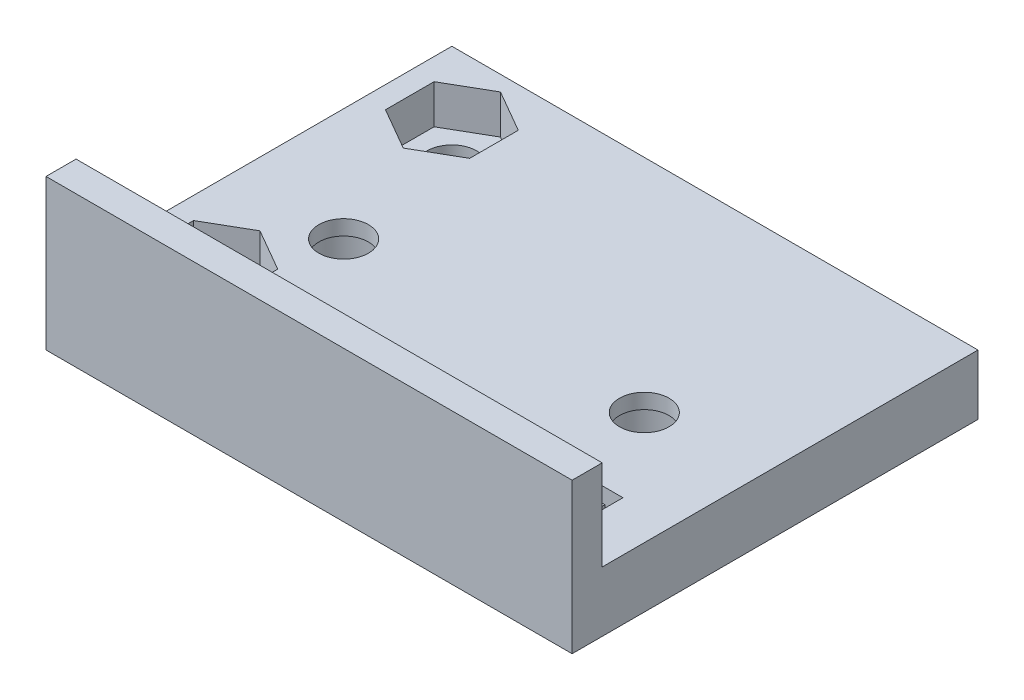
ISO-10303-21;
HEADER;
FILE_DESCRIPTION(('STEP AP214'),'2;1');
FILE_NAME('part.step','',(''),(''),'','','');
FILE_SCHEMA(('AUTOMOTIVE_DESIGN { 1 0 10303 214 1 1 1 1 }'));
ENDSEC;
DATA;
#1=APPLICATION_CONTEXT('core data for automotive mechanical design processes');
#2=APPLICATION_PROTOCOL_DEFINITION('international standard','automotive_design',2000,#1);
#3=PRODUCT_CONTEXT('',#1,'mechanical');
#4=PRODUCT('Part','Part','',(#3));
#5=PRODUCT_RELATED_PRODUCT_CATEGORY('part','',(#4));
#6=PRODUCT_DEFINITION_FORMATION('','',#4);
#7=PRODUCT_DEFINITION_CONTEXT('part definition',#1,'design');
#8=PRODUCT_DEFINITION('design','',#6,#7);
#9=PRODUCT_DEFINITION_SHAPE('','',#8);
#10=(LENGTH_UNIT() NAMED_UNIT(*) SI_UNIT(.MILLI.,.METRE.));
#11=(NAMED_UNIT(*) PLANE_ANGLE_UNIT() SI_UNIT($,.RADIAN.));
#12=(NAMED_UNIT(*) SI_UNIT($,.STERADIAN.) SOLID_ANGLE_UNIT());
#13=UNCERTAINTY_MEASURE_WITH_UNIT(LENGTH_MEASURE(1.E-05),#10,'distance_accuracy_value','');
#14=(GEOMETRIC_REPRESENTATION_CONTEXT(3) GLOBAL_UNCERTAINTY_ASSIGNED_CONTEXT((#13)) GLOBAL_UNIT_ASSIGNED_CONTEXT((#10,
#11,#12)) REPRESENTATION_CONTEXT('',''));
#15=CARTESIAN_POINT('',(0.,0.,0.));
#16=DIRECTION('',(0.,0.,1.));
#17=DIRECTION('',(1.,0.,0.));
#18=AXIS2_PLACEMENT_3D('',#15,#16,#17);
#19=CARTESIAN_POINT('',(10.,4.,1.2));
#20=DIRECTION('',(0.,-1.,0.));
#21=DIRECTION('',(0.,0.,-1.));
#22=AXIS2_PLACEMENT_3D('',#19,#20,#21);
#23=CYLINDRICAL_SURFACE('',#22,1.65);
#24=CARTESIAN_POINT('',(10.,4.,1.2));
#25=DIRECTION('',(0.,1.,0.));
#26=DIRECTION('',(0.,0.,1.));
#27=AXIS2_PLACEMENT_3D('',#24,#25,#26);
#28=CIRCLE('',#27,1.65);
#29=CARTESIAN_POINT('',(10.,4.,2.85));
#30=VERTEX_POINT('',#29);
#31=EDGE_CURVE('E402',#30,#30,#28,.T.);
#32=ORIENTED_EDGE('',*,*,#31,.T.);
#33=EDGE_LOOP('',(#32));
#34=FACE_BOUND('',#33,.T.);
#35=CARTESIAN_POINT('',(10.,3.,1.2));
#36=DIRECTION('',(0.,-1.,0.));
#37=DIRECTION('',(0.,0.,-1.));
#38=AXIS2_PLACEMENT_3D('',#35,#36,#37);
#39=CIRCLE('',#38,1.65);
#40=CARTESIAN_POINT('',(10.,3.,-0.449999999999999));
#41=VERTEX_POINT('',#40);
#42=EDGE_CURVE('E49',#41,#41,#39,.T.);
#43=ORIENTED_EDGE('',*,*,#42,.T.);
#44=EDGE_LOOP('',(#43));
#45=FACE_BOUND('',#44,.T.);
#46=ADVANCED_FACE('F45',(#34,#45),#23,.F.);
#47=CARTESIAN_POINT('',(-9.99999999999999,4.,1.2));
#48=DIRECTION('',(0.,-1.,0.));
#49=DIRECTION('',(0.,0.,-1.));
#50=AXIS2_PLACEMENT_3D('',#47,#48,#49);
#51=CYLINDRICAL_SURFACE('',#50,1.65);
#52=CARTESIAN_POINT('',(-9.99999999999999,4.,1.2));
#53=DIRECTION('',(0.,1.,0.));
#54=DIRECTION('',(0.,0.,-1.));
#55=AXIS2_PLACEMENT_3D('',#52,#53,#54);
#56=CIRCLE('',#55,1.65);
#57=CARTESIAN_POINT('',(-9.99999999999999,4.,-0.449999999999997));
#58=VERTEX_POINT('',#57);
#59=EDGE_CURVE('E399',#58,#58,#56,.T.);
#60=ORIENTED_EDGE('',*,*,#59,.T.);
#61=EDGE_LOOP('',(#60));
#62=FACE_BOUND('',#61,.T.);
#63=CARTESIAN_POINT('',(-9.99999999999999,3.,1.2));
#64=DIRECTION('',(0.,-1.,0.));
#65=DIRECTION('',(0.,0.,-1.));
#66=AXIS2_PLACEMENT_3D('',#63,#64,#65);
#67=CIRCLE('',#66,1.65);
#68=CARTESIAN_POINT('',(-9.99999999999999,3.,-0.449999999999997));
#69=VERTEX_POINT('',#68);
#70=EDGE_CURVE('E265',#69,#69,#67,.T.);
#71=ORIENTED_EDGE('',*,*,#70,.T.);
#72=EDGE_LOOP('',(#71));
#73=FACE_BOUND('',#72,.T.);
#74=ADVANCED_FACE('F499',(#62,#73),#51,.F.);
#75=CARTESIAN_POINT('',(-13.25,8.66690475583122,6.75));
#76=DIRECTION('',(0.,-1.,0.));
#77=DIRECTION('',(0.,0.,-1.));
#78=AXIS2_PLACEMENT_3D('',#75,#76,#77);
#79=CYLINDRICAL_SURFACE('',#78,1.65);
#80=CARTESIAN_POINT('',(-13.25,0.,6.75));
#81=DIRECTION('',(0.,-1.,0.));
#82=DIRECTION('',(0.,0.,1.));
#83=AXIS2_PLACEMENT_3D('',#80,#81,#82);
#84=CIRCLE('',#83,1.65);
#85=CARTESIAN_POINT('',(-13.25,0.,8.4));
#86=VERTEX_POINT('',#85);
#87=EDGE_CURVE('E377',#86,#86,#84,.T.);
#88=ORIENTED_EDGE('',*,*,#87,.T.);
#89=EDGE_LOOP('',(#88));
#90=FACE_BOUND('',#89,.T.);
#91=CARTESIAN_POINT('',(-13.25,1.4,6.75));
#92=DIRECTION('',(0.,1.,0.));
#93=DIRECTION('',(0.,0.,1.));
#94=AXIS2_PLACEMENT_3D('',#91,#92,#93);
#95=CIRCLE('',#94,1.65);
#96=CARTESIAN_POINT('',(-13.25,1.4,8.4));
#97=VERTEX_POINT('',#96);
#98=EDGE_CURVE('E380',#97,#97,#95,.F.);
#99=ORIENTED_EDGE('',*,*,#98,.F.);
#100=EDGE_LOOP('',(#99));
#101=FACE_BOUND('',#100,.T.);
#102=ADVANCED_FACE('F506',(#90,#101),#79,.F.);
#103=CARTESIAN_POINT('',(-13.25,8.66690475583122,-9.25));
#104=DIRECTION('',(0.,-1.,0.));
#105=DIRECTION('',(0.,0.,-1.));
#106=AXIS2_PLACEMENT_3D('',#103,#104,#105);
#107=CYLINDRICAL_SURFACE('',#106,1.65);
#108=CARTESIAN_POINT('',(-13.25,0.,-9.25));
#109=DIRECTION('',(0.,-1.,0.));
#110=DIRECTION('',(0.,0.,-1.));
#111=AXIS2_PLACEMENT_3D('',#108,#109,#110);
#112=CIRCLE('',#111,1.65);
#113=CARTESIAN_POINT('',(-13.25,0.,-10.9));
#114=VERTEX_POINT('',#113);
#115=EDGE_CURVE('E373',#114,#114,#112,.T.);
#116=ORIENTED_EDGE('',*,*,#115,.T.);
#117=EDGE_LOOP('',(#116));
#118=FACE_BOUND('',#117,.T.);
#119=CARTESIAN_POINT('',(-13.25,1.4,-9.25));
#120=DIRECTION('',(0.,1.,0.));
#121=DIRECTION('',(0.,0.,1.));
#122=AXIS2_PLACEMENT_3D('',#119,#120,#121);
#123=CIRCLE('',#122,1.65);
#124=CARTESIAN_POINT('',(-13.25,1.4,-7.6));
#125=VERTEX_POINT('',#124);
#126=EDGE_CURVE('E315',#125,#125,#123,.F.);
#127=ORIENTED_EDGE('',*,*,#126,.F.);
#128=EDGE_LOOP('',(#127));
#129=FACE_BOUND('',#128,.T.);
#130=ADVANCED_FACE('F510',(#118,#129),#107,.F.);
#131=CARTESIAN_POINT('',(0.,4.,0.));
#132=DIRECTION('',(0.,-1.,0.));
#133=DIRECTION('',(0.,0.,-1.));
#134=AXIS2_PLACEMENT_3D('',#131,#132,#133);
#135=PLANE('',#134);
#136=DIRECTION('',(0.,0.,1.));
#137=VECTOR('',#136,1.);
#138=CARTESIAN_POINT('',(5.8,4.,6.819052272277));
#139=LINE('',#138,#137);
#140=CARTESIAN_POINT('',(5.8,4.,6.819052272277));
#141=VERTEX_POINT('',#140);
#142=CARTESIAN_POINT('',(5.8,4.,9.619052272277));
#143=VERTEX_POINT('',#142);
#144=EDGE_CURVE('E250',#141,#143,#139,.T.);
#145=ORIENTED_EDGE('',*,*,#144,.F.);
#146=DIRECTION('',(-1.,0.,0.));
#147=VECTOR('',#146,1.);
#148=CARTESIAN_POINT('',(14.2,4.,6.819052272277));
#149=LINE('',#148,#147);
#150=CARTESIAN_POINT('',(14.2,4.,6.819052272277));
#151=VERTEX_POINT('',#150);
#152=EDGE_CURVE('E275',#151,#141,#149,.T.);
#153=ORIENTED_EDGE('',*,*,#152,.F.);
#154=DIRECTION('',(0.,0.,-1.));
#155=VECTOR('',#154,1.);
#156=CARTESIAN_POINT('',(14.2,4.,6.819052272277));
#157=LINE('',#156,#155);
#158=CARTESIAN_POINT('',(14.2,4.,9.619052272277));
#159=VERTEX_POINT('',#158);
#160=EDGE_CURVE('E825',#159,#151,#157,.T.);
#161=ORIENTED_EDGE('',*,*,#160,.F.);
#162=DIRECTION('',(1.,0.,0.));
#163=VECTOR('',#162,1.);
#164=CARTESIAN_POINT('',(14.2,4.,9.619052272277));
#165=LINE('',#164,#163);
#166=EDGE_CURVE('E820',#143,#159,#165,.T.);
#167=ORIENTED_EDGE('',*,*,#166,.F.);
#168=EDGE_LOOP('',(#145,#153,#161,#167));
#169=FACE_BOUND('',#168,.T.);
#170=DIRECTION('',(0.,0.,-1.));
#171=VECTOR('',#170,1.);
#172=CARTESIAN_POINT('',(-10.45,4.,-7.63341924626905));
#173=LINE('',#172,#171);
#174=CARTESIAN_POINT('',(-10.45,4.,-7.63341924626905));
#175=VERTEX_POINT('',#174);
#176=CARTESIAN_POINT('',(-10.45,4.,-10.866580753731));
#177=VERTEX_POINT('',#176);
#178=EDGE_CURVE('E298',#175,#177,#173,.T.);
#179=ORIENTED_EDGE('',*,*,#178,.F.);
#180=DIRECTION('',(0.866025403784439,0.,-0.5));
#181=VECTOR('',#180,1.);
#182=CARTESIAN_POINT('',(-13.25,4.,-6.0168384925381));
#183=LINE('',#182,#181);
#184=CARTESIAN_POINT('',(-13.25,4.,-6.0168384925381));
#185=VERTEX_POINT('',#184);
#186=EDGE_CURVE('E296',#185,#175,#183,.T.);
#187=ORIENTED_EDGE('',*,*,#186,.F.);
#188=DIRECTION('',(0.866025403784438,0.,0.5));
#189=VECTOR('',#188,1.);
#190=CARTESIAN_POINT('',(-16.05,4.,-7.63341924626905));
#191=LINE('',#190,#189);
#192=CARTESIAN_POINT('',(-16.05,4.,-7.63341924626905));
#193=VERTEX_POINT('',#192);
#194=EDGE_CURVE('E280',#193,#185,#191,.T.);
#195=ORIENTED_EDGE('',*,*,#194,.F.);
#196=DIRECTION('',(0.,0.,1.));
#197=VECTOR('',#196,1.);
#198=CARTESIAN_POINT('',(-16.05,4.,-10.866580753731));
#199=LINE('',#198,#197);
#200=CARTESIAN_POINT('',(-16.05,4.,-10.866580753731));
#201=VERTEX_POINT('',#200);
#202=EDGE_CURVE('E308',#201,#193,#199,.T.);
#203=ORIENTED_EDGE('',*,*,#202,.F.);
#204=DIRECTION('',(-0.866025403784438,0.,0.5));
#205=VECTOR('',#204,1.);
#206=CARTESIAN_POINT('',(-13.25,4.,-12.4831615074619));
#207=LINE('',#206,#205);
#208=CARTESIAN_POINT('',(-13.25,4.,-12.4831615074619));
#209=VERTEX_POINT('',#208);
#210=EDGE_CURVE('E305',#209,#201,#207,.T.);
#211=ORIENTED_EDGE('',*,*,#210,.F.);
#212=DIRECTION('',(-0.866025403784439,0.,-0.499999999999999));
#213=VECTOR('',#212,1.);
#214=CARTESIAN_POINT('',(-10.45,4.,-10.866580753731));
#215=LINE('',#214,#213);
#216=EDGE_CURVE('E302',#177,#209,#215,.T.);
#217=ORIENTED_EDGE('',*,*,#216,.F.);
#218=EDGE_LOOP('',(#179,#187,#195,#203,#211,#217));
#219=FACE_BOUND('',#218,.T.);
#220=DIRECTION('',(-0.866025403784439,0.,-0.5));
#221=VECTOR('',#220,1.);
#222=CARTESIAN_POINT('',(-10.45,4.,5.13341924626904));
#223=LINE('',#222,#221);
#224=CARTESIAN_POINT('',(-10.45,4.,5.13341924626904));
#225=VERTEX_POINT('',#224);
#226=CARTESIAN_POINT('',(-13.25,4.,3.51683849253808));
#227=VERTEX_POINT('',#226);
#228=EDGE_CURVE('E353',#225,#227,#223,.T.);
#229=ORIENTED_EDGE('',*,*,#228,.F.);
#230=DIRECTION('',(0.,0.,-1.));
#231=VECTOR('',#230,1.);
#232=CARTESIAN_POINT('',(-10.45,4.,8.36658075373096));
#233=LINE('',#232,#231);
#234=CARTESIAN_POINT('',(-10.45,4.,8.36658075373096));
#235=VERTEX_POINT('',#234);
#236=EDGE_CURVE('E299',#235,#225,#233,.T.);
#237=ORIENTED_EDGE('',*,*,#236,.F.);
#238=DIRECTION('',(0.866025403784438,0.,-0.5));
#239=VECTOR('',#238,1.);
#240=CARTESIAN_POINT('',(-13.25,4.,9.98316150746191));
#241=LINE('',#240,#239);
#242=CARTESIAN_POINT('',(-13.25,4.,9.98316150746191));
#243=VERTEX_POINT('',#242);
#244=EDGE_CURVE('E340',#243,#235,#241,.T.);
#245=ORIENTED_EDGE('',*,*,#244,.F.);
#246=DIRECTION('',(0.866025403784439,0.,0.5));
#247=VECTOR('',#246,1.);
#248=CARTESIAN_POINT('',(-16.05,4.,8.36658075373096));
#249=LINE('',#248,#247);
#250=CARTESIAN_POINT('',(-16.05,4.,8.36658075373096));
#251=VERTEX_POINT('',#250);
#252=EDGE_CURVE('E343',#251,#243,#249,.T.);
#253=ORIENTED_EDGE('',*,*,#252,.F.);
#254=DIRECTION('',(0.,0.,1.));
#255=VECTOR('',#254,1.);
#256=CARTESIAN_POINT('',(-16.05,4.,5.13341924626904));
#257=LINE('',#256,#255);
#258=CARTESIAN_POINT('',(-16.05,4.,5.13341924626904));
#259=VERTEX_POINT('',#258);
#260=EDGE_CURVE('E347',#259,#251,#257,.T.);
#261=ORIENTED_EDGE('',*,*,#260,.F.);
#262=DIRECTION('',(-0.866025403784438,0.,0.500000000000001));
#263=VECTOR('',#262,1.);
#264=CARTESIAN_POINT('',(-13.25,4.,3.51683849253808));
#265=LINE('',#264,#263);
#266=EDGE_CURVE('E350',#227,#259,#265,.T.);
#267=ORIENTED_EDGE('',*,*,#266,.F.);
#268=EDGE_LOOP('',(#229,#237,#245,#253,#261,#267));
#269=FACE_BOUND('',#268,.T.);
#270=ORIENTED_EDGE('',*,*,#59,.F.);
#271=EDGE_LOOP('',(#270));
#272=FACE_BOUND('',#271,.T.);
#273=ORIENTED_EDGE('',*,*,#31,.F.);
#274=EDGE_LOOP('',(#273));
#275=FACE_BOUND('',#274,.T.);
#276=DIRECTION('',(-1.,0.,0.));
#277=VECTOR('',#276,1.);
#278=CARTESIAN_POINT('',(-17.5,4.,11.5));
#279=LINE('',#278,#277);
#280=CARTESIAN_POINT('',(17.5,4.,11.5));
#281=VERTEX_POINT('',#280);
#282=CARTESIAN_POINT('',(-17.5,4.,11.5));
#283=VERTEX_POINT('',#282);
#284=EDGE_CURVE('E376',#281,#283,#279,.T.);
#285=ORIENTED_EDGE('',*,*,#284,.F.);
#286=DIRECTION('',(0.,0.,-1.));
#287=VECTOR('',#286,1.);
#288=CARTESIAN_POINT('',(17.5,4.,13.5));
#289=LINE('',#288,#287);
#290=CARTESIAN_POINT('',(17.5,4.,-13.5));
#291=VERTEX_POINT('',#290);
#292=EDGE_CURVE('E406',#281,#291,#289,.T.);
#293=ORIENTED_EDGE('',*,*,#292,.T.);
#294=DIRECTION('',(-1.,0.,0.));
#295=VECTOR('',#294,1.);
#296=CARTESIAN_POINT('',(-17.5,4.,-13.5));
#297=LINE('',#296,#295);
#298=CARTESIAN_POINT('',(-17.5,4.,-13.5));
#299=VERTEX_POINT('',#298);
#300=EDGE_CURVE('E408',#291,#299,#297,.T.);
#301=ORIENTED_EDGE('',*,*,#300,.T.);
#302=DIRECTION('',(0.,0.,1.));
#303=VECTOR('',#302,1.);
#304=CARTESIAN_POINT('',(-17.5,4.,13.5));
#305=LINE('',#304,#303);
#306=EDGE_CURVE('E411',#299,#283,#305,.T.);
#307=ORIENTED_EDGE('',*,*,#306,.T.);
#308=EDGE_LOOP('',(#285,#293,#301,#307));
#309=FACE_BOUND('',#308,.T.);
#310=ADVANCED_FACE('F455',(#169,#219,#269,#272,#275,#309),#135,.F.);
#311=CARTESIAN_POINT('',(0.,0.,0.));
#312=DIRECTION('',(0.,-1.,0.));
#313=DIRECTION('',(0.,0.,-1.));
#314=AXIS2_PLACEMENT_3D('',#311,#312,#313);
#315=PLANE('',#314);
#316=DIRECTION('',(0.,0.,-1.));
#317=VECTOR('',#316,1.);
#318=CARTESIAN_POINT('',(13.,0.,6.819052272277));
#319=LINE('',#318,#317);
#320=CARTESIAN_POINT('',(13.,0.,9.619052272277));
#321=VERTEX_POINT('',#320);
#322=CARTESIAN_POINT('',(13.,0.,6.819052272277));
#323=VERTEX_POINT('',#322);
#324=EDGE_CURVE('E259',#321,#323,#319,.T.);
#325=ORIENTED_EDGE('',*,*,#324,.F.);
#326=DIRECTION('',(-1.,0.,0.));
#327=VECTOR('',#326,1.);
#328=CARTESIAN_POINT('',(14.2,0.,9.619052272277));
#329=LINE('',#328,#327);
#330=CARTESIAN_POINT('',(14.2,0.,9.619052272277));
#331=VERTEX_POINT('',#330);
#332=EDGE_CURVE('E838',#331,#321,#329,.T.);
#333=ORIENTED_EDGE('',*,*,#332,.F.);
#334=DIRECTION('',(0.,0.,1.));
#335=VECTOR('',#334,1.);
#336=CARTESIAN_POINT('',(14.2,0.,6.819052272277));
#337=LINE('',#336,#335);
#338=CARTESIAN_POINT('',(14.2,0.,6.819052272277));
#339=VERTEX_POINT('',#338);
#340=EDGE_CURVE('E835',#339,#331,#337,.T.);
#341=ORIENTED_EDGE('',*,*,#340,.F.);
#342=DIRECTION('',(1.,0.,0.));
#343=VECTOR('',#342,1.);
#344=CARTESIAN_POINT('',(14.2,0.,6.819052272277));
#345=LINE('',#344,#343);
#346=EDGE_CURVE('E833',#323,#339,#345,.T.);
#347=ORIENTED_EDGE('',*,*,#346,.F.);
#348=EDGE_LOOP('',(#325,#333,#341,#347));
#349=FACE_BOUND('',#348,.T.);
#350=DIRECTION('',(1.,0.,0.));
#351=VECTOR('',#350,1.);
#352=CARTESIAN_POINT('',(5.8,0.,6.819052272277));
#353=LINE('',#352,#351);
#354=CARTESIAN_POINT('',(5.8,0.,6.819052272277));
#355=VERTEX_POINT('',#354);
#356=CARTESIAN_POINT('',(7.,0.,6.819052272277));
#357=VERTEX_POINT('',#356);
#358=EDGE_CURVE('E256',#355,#357,#353,.T.);
#359=ORIENTED_EDGE('',*,*,#358,.F.);
#360=DIRECTION('',(0.,0.,-1.));
#361=VECTOR('',#360,1.);
#362=CARTESIAN_POINT('',(5.8,0.,6.819052272277));
#363=LINE('',#362,#361);
#364=CARTESIAN_POINT('',(5.8,0.,9.619052272277));
#365=VERTEX_POINT('',#364);
#366=EDGE_CURVE('E243',#365,#355,#363,.T.);
#367=ORIENTED_EDGE('',*,*,#366,.F.);
#368=DIRECTION('',(-1.,0.,0.));
#369=VECTOR('',#368,1.);
#370=CARTESIAN_POINT('',(5.8,0.,9.619052272277));
#371=LINE('',#370,#369);
#372=CARTESIAN_POINT('',(7.,0.,9.619052272277));
#373=VERTEX_POINT('',#372);
#374=EDGE_CURVE('E253',#373,#365,#371,.T.);
#375=ORIENTED_EDGE('',*,*,#374,.F.);
#376=DIRECTION('',(0.,0.,1.));
#377=VECTOR('',#376,1.);
#378=CARTESIAN_POINT('',(7.,0.,6.819052272277));
#379=LINE('',#378,#377);
#380=EDGE_CURVE('E238',#357,#373,#379,.T.);
#381=ORIENTED_EDGE('',*,*,#380,.F.);
#382=EDGE_LOOP('',(#359,#367,#375,#381));
#383=FACE_BOUND('',#382,.T.);
#384=CARTESIAN_POINT('',(-9.99999999999999,0.,1.2));
#385=DIRECTION('',(0.,-1.,0.));
#386=DIRECTION('',(0.,0.,-1.));
#387=AXIS2_PLACEMENT_3D('',#384,#385,#386);
#388=CIRCLE('',#387,2.7);
#389=CARTESIAN_POINT('',(-9.99999999999999,0.,-1.5));
#390=VERTEX_POINT('',#389);
#391=EDGE_CURVE('E266',#390,#390,#388,.T.);
#392=ORIENTED_EDGE('',*,*,#391,.F.);
#393=EDGE_LOOP('',(#392));
#394=FACE_BOUND('',#393,.T.);
#395=CARTESIAN_POINT('',(10.,0.,1.2));
#396=DIRECTION('',(0.,-1.,0.));
#397=DIRECTION('',(0.,0.,-1.));
#398=AXIS2_PLACEMENT_3D('',#395,#396,#397);
#399=CIRCLE('',#398,2.7);
#400=CARTESIAN_POINT('',(10.,0.,-1.5));
#401=VERTEX_POINT('',#400);
#402=EDGE_CURVE('E269',#401,#401,#399,.T.);
#403=ORIENTED_EDGE('',*,*,#402,.F.);
#404=EDGE_LOOP('',(#403));
#405=FACE_BOUND('',#404,.T.);
#406=ORIENTED_EDGE('',*,*,#115,.F.);
#407=EDGE_LOOP('',(#406));
#408=FACE_BOUND('',#407,.T.);
#409=ORIENTED_EDGE('',*,*,#87,.F.);
#410=EDGE_LOOP('',(#409));
#411=FACE_BOUND('',#410,.T.);
#412=DIRECTION('',(0.,0.,-1.));
#413=VECTOR('',#412,1.);
#414=CARTESIAN_POINT('',(17.5,0.,13.5));
#415=LINE('',#414,#413);
#416=CARTESIAN_POINT('',(17.5,0.,13.5));
#417=VERTEX_POINT('',#416);
#418=CARTESIAN_POINT('',(17.5,0.,-13.5));
#419=VERTEX_POINT('',#418);
#420=EDGE_CURVE('E405',#417,#419,#415,.T.);
#421=ORIENTED_EDGE('',*,*,#420,.F.);
#422=DIRECTION('',(1.,0.,0.));
#423=VECTOR('',#422,1.);
#424=CARTESIAN_POINT('',(-17.5,0.,13.5));
#425=LINE('',#424,#423);
#426=CARTESIAN_POINT('',(-17.5,0.,13.5));
#427=VERTEX_POINT('',#426);
#428=EDGE_CURVE('E409',#427,#417,#425,.T.);
#429=ORIENTED_EDGE('',*,*,#428,.F.);
#430=DIRECTION('',(0.,0.,1.));
#431=VECTOR('',#430,1.);
#432=CARTESIAN_POINT('',(-17.5,0.,13.5));
#433=LINE('',#432,#431);
#434=CARTESIAN_POINT('',(-17.5,0.,-13.5));
#435=VERTEX_POINT('',#434);
#436=EDGE_CURVE('E418',#435,#427,#433,.T.);
#437=ORIENTED_EDGE('',*,*,#436,.F.);
#438=DIRECTION('',(-1.,0.,0.));
#439=VECTOR('',#438,1.);
#440=CARTESIAN_POINT('',(-17.5,0.,-13.5));
#441=LINE('',#440,#439);
#442=EDGE_CURVE('E416',#419,#435,#441,.T.);
#443=ORIENTED_EDGE('',*,*,#442,.F.);
#444=EDGE_LOOP('',(#421,#429,#437,#443));
#445=FACE_BOUND('',#444,.T.);
#446=ADVANCED_FACE('F452',(#349,#383,#394,#405,#408,#411,#445),#315,.T.);
#447=CARTESIAN_POINT('',(17.5,4.,13.5));
#448=DIRECTION('',(-1.,0.,0.));
#449=DIRECTION('',(0.,0.,1.));
#450=AXIS2_PLACEMENT_3D('',#447,#448,#449);
#451=PLANE('',#450);
#452=ORIENTED_EDGE('',*,*,#420,.T.);
#453=DIRECTION('',(0.,-1.,0.));
#454=VECTOR('',#453,1.);
#455=CARTESIAN_POINT('',(17.5,4.,-13.5));
#456=LINE('',#455,#454);
#457=EDGE_CURVE('E11',#291,#419,#456,.T.);
#458=ORIENTED_EDGE('',*,*,#457,.F.);
#459=ORIENTED_EDGE('',*,*,#292,.F.);
#460=DIRECTION('',(0.,-1.,0.));
#461=VECTOR('',#460,1.);
#462=CARTESIAN_POINT('',(17.5,10.,11.5));
#463=LINE('',#462,#461);
#464=CARTESIAN_POINT('',(17.5,10.,11.5));
#465=VERTEX_POINT('',#464);
#466=EDGE_CURVE('E396',#465,#281,#463,.T.);
#467=ORIENTED_EDGE('',*,*,#466,.F.);
#468=DIRECTION('',(0.,0.,-1.));
#469=VECTOR('',#468,1.);
#470=CARTESIAN_POINT('',(17.5,10.,11.5));
#471=LINE('',#470,#469);
#472=CARTESIAN_POINT('',(17.5,10.,13.5));
#473=VERTEX_POINT('',#472);
#474=EDGE_CURVE('E387',#473,#465,#471,.T.);
#475=ORIENTED_EDGE('',*,*,#474,.F.);
#476=DIRECTION('',(0.,-1.,0.));
#477=VECTOR('',#476,1.);
#478=CARTESIAN_POINT('',(17.5,4.,13.5));
#479=LINE('',#478,#477);
#480=EDGE_CURVE('E413',#473,#417,#479,.T.);
#481=ORIENTED_EDGE('',*,*,#480,.T.);
#482=EDGE_LOOP('',(#452,#458,#459,#467,#475,#481));
#483=FACE_BOUND('',#482,.T.);
#484=ADVANCED_FACE('F47',(#483),#451,.F.);
#485=CARTESIAN_POINT('',(-17.5,4.,-13.5));
#486=DIRECTION('',(0.,0.,1.));
#487=DIRECTION('',(1.,0.,0.));
#488=AXIS2_PLACEMENT_3D('',#485,#486,#487);
#489=PLANE('',#488);
#490=ORIENTED_EDGE('',*,*,#442,.T.);
#491=DIRECTION('',(0.,-1.,0.));
#492=VECTOR('',#491,1.);
#493=CARTESIAN_POINT('',(-17.5,4.,-13.5));
#494=LINE('',#493,#492);
#495=EDGE_CURVE('E54',#299,#435,#494,.T.);
#496=ORIENTED_EDGE('',*,*,#495,.F.);
#497=ORIENTED_EDGE('',*,*,#300,.F.);
#498=ORIENTED_EDGE('',*,*,#457,.T.);
#499=EDGE_LOOP('',(#490,#496,#497,#498));
#500=FACE_BOUND('',#499,.T.);
#501=ADVANCED_FACE('F484',(#500),#489,.F.);
#502=CARTESIAN_POINT('',(-17.5,4.,13.5));
#503=DIRECTION('',(1.,0.,0.));
#504=DIRECTION('',(0.,0.,-1.));
#505=AXIS2_PLACEMENT_3D('',#502,#503,#504);
#506=PLANE('',#505);
#507=ORIENTED_EDGE('',*,*,#436,.T.);
#508=DIRECTION('',(0.,-1.,0.));
#509=VECTOR('',#508,1.);
#510=CARTESIAN_POINT('',(-17.5,4.,13.5));
#511=LINE('',#510,#509);
#512=CARTESIAN_POINT('',(-17.5,10.,13.5));
#513=VERTEX_POINT('',#512);
#514=EDGE_CURVE('E423',#513,#427,#511,.T.);
#515=ORIENTED_EDGE('',*,*,#514,.F.);
#516=DIRECTION('',(0.,0.,1.));
#517=VECTOR('',#516,1.);
#518=CARTESIAN_POINT('',(-17.5,10.,13.5));
#519=LINE('',#518,#517);
#520=CARTESIAN_POINT('',(-17.5,10.,11.5));
#521=VERTEX_POINT('',#520);
#522=EDGE_CURVE('E381',#521,#513,#519,.T.);
#523=ORIENTED_EDGE('',*,*,#522,.F.);
#524=DIRECTION('',(0.,-1.,0.));
#525=VECTOR('',#524,1.);
#526=CARTESIAN_POINT('',(-17.5,10.,11.5));
#527=LINE('',#526,#525);
#528=EDGE_CURVE('E391',#521,#283,#527,.T.);
#529=ORIENTED_EDGE('',*,*,#528,.T.);
#530=ORIENTED_EDGE('',*,*,#306,.F.);
#531=ORIENTED_EDGE('',*,*,#495,.T.);
#532=EDGE_LOOP('',(#507,#515,#523,#529,#530,#531));
#533=FACE_BOUND('',#532,.T.);
#534=ADVANCED_FACE('F479',(#533),#506,.F.);
#535=CARTESIAN_POINT('',(-17.5,4.,13.5));
#536=DIRECTION('',(0.,0.,-1.));
#537=DIRECTION('',(-1.,0.,0.));
#538=AXIS2_PLACEMENT_3D('',#535,#536,#537);
#539=PLANE('',#538);
#540=ORIENTED_EDGE('',*,*,#428,.T.);
#541=ORIENTED_EDGE('',*,*,#480,.F.);
#542=DIRECTION('',(1.,0.,0.));
#543=VECTOR('',#542,1.);
#544=CARTESIAN_POINT('',(17.5,10.,13.5));
#545=LINE('',#544,#543);
#546=EDGE_CURVE('E384',#513,#473,#545,.T.);
#547=ORIENTED_EDGE('',*,*,#546,.F.);
#548=ORIENTED_EDGE('',*,*,#514,.T.);
#549=EDGE_LOOP('',(#540,#541,#547,#548));
#550=FACE_BOUND('',#549,.T.);
#551=ADVANCED_FACE('F472',(#550),#539,.F.);
#552=CARTESIAN_POINT('',(-17.5,10.,11.5));
#553=DIRECTION('',(0.,0.,1.));
#554=DIRECTION('',(1.,0.,0.));
#555=AXIS2_PLACEMENT_3D('',#552,#553,#554);
#556=PLANE('',#555);
#557=ORIENTED_EDGE('',*,*,#284,.T.);
#558=ORIENTED_EDGE('',*,*,#528,.F.);
#559=DIRECTION('',(-1.,0.,0.));
#560=VECTOR('',#559,1.);
#561=CARTESIAN_POINT('',(-17.5,10.,11.5));
#562=LINE('',#561,#560);
#563=EDGE_CURVE('E389',#465,#521,#562,.T.);
#564=ORIENTED_EDGE('',*,*,#563,.F.);
#565=ORIENTED_EDGE('',*,*,#466,.T.);
#566=EDGE_LOOP('',(#557,#558,#564,#565));
#567=FACE_BOUND('',#566,.T.);
#568=ADVANCED_FACE('F487',(#567),#556,.F.);
#569=CARTESIAN_POINT('',(0.,10.,0.));
#570=DIRECTION('',(0.,-1.,0.));
#571=DIRECTION('',(0.,0.,-1.));
#572=AXIS2_PLACEMENT_3D('',#569,#570,#571);
#573=PLANE('',#572);
#574=ORIENTED_EDGE('',*,*,#522,.T.);
#575=ORIENTED_EDGE('',*,*,#546,.T.);
#576=ORIENTED_EDGE('',*,*,#474,.T.);
#577=ORIENTED_EDGE('',*,*,#563,.T.);
#578=EDGE_LOOP('',(#574,#575,#576,#577));
#579=FACE_BOUND('',#578,.T.);
#580=ADVANCED_FACE('F474',(#579),#573,.F.);
#581=CARTESIAN_POINT('',(0.,1.4,0.));
#582=DIRECTION('',(0.,1.,0.));
#583=DIRECTION('',(0.,0.,1.));
#584=AXIS2_PLACEMENT_3D('',#581,#582,#583);
#585=PLANE('',#584);
#586=DIRECTION('',(0.866025403784439,0.,-0.5));
#587=VECTOR('',#586,1.);
#588=CARTESIAN_POINT('',(-13.25,1.4,-6.0168384925381));
#589=LINE('',#588,#587);
#590=CARTESIAN_POINT('',(-13.25,1.4,-6.0168384925381));
#591=VERTEX_POINT('',#590);
#592=CARTESIAN_POINT('',(-10.45,1.4,-7.63341924626905));
#593=VERTEX_POINT('',#592);
#594=EDGE_CURVE('E276',#591,#593,#589,.T.);
#595=ORIENTED_EDGE('',*,*,#594,.T.);
#596=DIRECTION('',(0.,0.,-1.));
#597=VECTOR('',#596,1.);
#598=CARTESIAN_POINT('',(-10.45,1.4,-7.63341924626905));
#599=LINE('',#598,#597);
#600=CARTESIAN_POINT('',(-10.45,1.4,-10.866580753731));
#601=VERTEX_POINT('',#600);
#602=EDGE_CURVE('E279',#593,#601,#599,.T.);
#603=ORIENTED_EDGE('',*,*,#602,.T.);
#604=DIRECTION('',(-0.866025403784439,0.,-0.499999999999999));
#605=VECTOR('',#604,1.);
#606=CARTESIAN_POINT('',(-10.45,1.4,-10.866580753731));
#607=LINE('',#606,#605);
#608=CARTESIAN_POINT('',(-13.25,1.4,-12.4831615074619));
#609=VERTEX_POINT('',#608);
#610=EDGE_CURVE('E283',#601,#609,#607,.T.);
#611=ORIENTED_EDGE('',*,*,#610,.T.);
#612=DIRECTION('',(-0.866025403784438,0.,0.5));
#613=VECTOR('',#612,1.);
#614=CARTESIAN_POINT('',(-13.25,1.4,-12.4831615074619));
#615=LINE('',#614,#613);
#616=CARTESIAN_POINT('',(-16.05,1.4,-10.866580753731));
#617=VERTEX_POINT('',#616);
#618=EDGE_CURVE('E286',#609,#617,#615,.T.);
#619=ORIENTED_EDGE('',*,*,#618,.T.);
#620=DIRECTION('',(0.,0.,1.));
#621=VECTOR('',#620,1.);
#622=CARTESIAN_POINT('',(-16.05,1.4,-10.866580753731));
#623=LINE('',#622,#621);
#624=CARTESIAN_POINT('',(-16.05,1.4,-7.63341924626905));
#625=VERTEX_POINT('',#624);
#626=EDGE_CURVE('E289',#617,#625,#623,.T.);
#627=ORIENTED_EDGE('',*,*,#626,.T.);
#628=DIRECTION('',(0.866025403784438,0.,0.5));
#629=VECTOR('',#628,1.);
#630=CARTESIAN_POINT('',(-16.05,1.4,-7.63341924626905));
#631=LINE('',#630,#629);
#632=EDGE_CURVE('E292',#625,#591,#631,.T.);
#633=ORIENTED_EDGE('',*,*,#632,.T.);
#634=EDGE_LOOP('',(#595,#603,#611,#619,#627,#633));
#635=FACE_BOUND('',#634,.T.);
#636=ORIENTED_EDGE('',*,*,#126,.T.);
#637=EDGE_LOOP('',(#636));
#638=FACE_BOUND('',#637,.T.);
#639=ADVANCED_FACE('F494',(#635,#638),#585,.T.);
#640=CARTESIAN_POINT('',(-13.25,1.4,-6.0168384925381));
#641=DIRECTION('',(0.5,0.,0.866025403784439));
#642=DIRECTION('',(0.866025403784439,0.,-0.5));
#643=AXIS2_PLACEMENT_3D('',#640,#641,#642);
#644=PLANE('',#643);
#645=ORIENTED_EDGE('',*,*,#186,.T.);
#646=DIRECTION('',(0.,1.,0.));
#647=VECTOR('',#646,1.);
#648=CARTESIAN_POINT('',(-10.45,1.4,-7.63341924626905));
#649=LINE('',#648,#647);
#650=EDGE_CURVE('E295',#593,#175,#649,.T.);
#651=ORIENTED_EDGE('',*,*,#650,.F.);
#652=ORIENTED_EDGE('',*,*,#594,.F.);
#653=DIRECTION('',(0.,1.,0.));
#654=VECTOR('',#653,1.);
#655=CARTESIAN_POINT('',(-13.25,1.4,-6.0168384925381));
#656=LINE('',#655,#654);
#657=EDGE_CURVE('E313',#591,#185,#656,.T.);
#658=ORIENTED_EDGE('',*,*,#657,.T.);
#659=EDGE_LOOP('',(#645,#651,#652,#658));
#660=FACE_BOUND('',#659,.T.);
#661=ADVANCED_FACE('F570',(#660),#644,.F.);
#662=CARTESIAN_POINT('',(-16.05,1.4,-7.63341924626905));
#663=DIRECTION('',(-0.5,0.,0.866025403784438));
#664=DIRECTION('',(0.866025403784438,0.,0.5));
#665=AXIS2_PLACEMENT_3D('',#662,#663,#664);
#666=PLANE('',#665);
#667=ORIENTED_EDGE('',*,*,#194,.T.);
#668=ORIENTED_EDGE('',*,*,#657,.F.);
#669=ORIENTED_EDGE('',*,*,#632,.F.);
#670=DIRECTION('',(0.,1.,0.));
#671=VECTOR('',#670,1.);
#672=CARTESIAN_POINT('',(-16.05,1.4,-7.63341924626905));
#673=LINE('',#672,#671);
#674=EDGE_CURVE('E316',#625,#193,#673,.T.);
#675=ORIENTED_EDGE('',*,*,#674,.T.);
#676=EDGE_LOOP('',(#667,#668,#669,#675));
#677=FACE_BOUND('',#676,.T.);
#678=ADVANCED_FACE('F580',(#677),#666,.F.);
#679=CARTESIAN_POINT('',(-16.05,1.4,-10.866580753731));
#680=DIRECTION('',(-1.,0.,0.));
#681=DIRECTION('',(0.,0.,1.));
#682=AXIS2_PLACEMENT_3D('',#679,#680,#681);
#683=PLANE('',#682);
#684=ORIENTED_EDGE('',*,*,#202,.T.);
#685=ORIENTED_EDGE('',*,*,#674,.F.);
#686=ORIENTED_EDGE('',*,*,#626,.F.);
#687=DIRECTION('',(0.,1.,0.));
#688=VECTOR('',#687,1.);
#689=CARTESIAN_POINT('',(-16.05,1.4,-10.866580753731));
#690=LINE('',#689,#688);
#691=EDGE_CURVE('E318',#617,#201,#690,.T.);
#692=ORIENTED_EDGE('',*,*,#691,.T.);
#693=EDGE_LOOP('',(#684,#685,#686,#692));
#694=FACE_BOUND('',#693,.T.);
#695=ADVANCED_FACE('F590',(#694),#683,.F.);
#696=CARTESIAN_POINT('',(-13.25,1.4,-12.4831615074619));
#697=DIRECTION('',(-0.5,0.,-0.866025403784439));
#698=DIRECTION('',(-0.866025403784439,0.,0.5));
#699=AXIS2_PLACEMENT_3D('',#696,#697,#698);
#700=PLANE('',#699);
#701=ORIENTED_EDGE('',*,*,#210,.T.);
#702=ORIENTED_EDGE('',*,*,#691,.F.);
#703=ORIENTED_EDGE('',*,*,#618,.F.);
#704=DIRECTION('',(0.,1.,0.));
#705=VECTOR('',#704,1.);
#706=CARTESIAN_POINT('',(-13.25,1.4,-12.4831615074619));
#707=LINE('',#706,#705);
#708=EDGE_CURVE('E320',#609,#209,#707,.T.);
#709=ORIENTED_EDGE('',*,*,#708,.T.);
#710=EDGE_LOOP('',(#701,#702,#703,#709));
#711=FACE_BOUND('',#710,.T.);
#712=ADVANCED_FACE('F600',(#711),#700,.F.);
#713=CARTESIAN_POINT('',(-10.45,1.4,-10.866580753731));
#714=DIRECTION('',(0.499999999999999,0.,-0.866025403784439));
#715=DIRECTION('',(-0.866025403784439,0.,-0.499999999999999));
#716=AXIS2_PLACEMENT_3D('',#713,#714,#715);
#717=PLANE('',#716);
#718=ORIENTED_EDGE('',*,*,#216,.T.);
#719=ORIENTED_EDGE('',*,*,#708,.F.);
#720=ORIENTED_EDGE('',*,*,#610,.F.);
#721=DIRECTION('',(0.,1.,0.));
#722=VECTOR('',#721,1.);
#723=CARTESIAN_POINT('',(-10.45,1.4,-10.866580753731));
#724=LINE('',#723,#722);
#725=EDGE_CURVE('E322',#601,#177,#724,.T.);
#726=ORIENTED_EDGE('',*,*,#725,.T.);
#727=EDGE_LOOP('',(#718,#719,#720,#726));
#728=FACE_BOUND('',#727,.T.);
#729=ADVANCED_FACE('F610',(#728),#717,.F.);
#730=CARTESIAN_POINT('',(-10.45,1.4,-7.63341924626905));
#731=DIRECTION('',(1.,0.,0.));
#732=DIRECTION('',(0.,0.,-1.));
#733=AXIS2_PLACEMENT_3D('',#730,#731,#732);
#734=PLANE('',#733);
#735=ORIENTED_EDGE('',*,*,#178,.T.);
#736=ORIENTED_EDGE('',*,*,#725,.F.);
#737=ORIENTED_EDGE('',*,*,#602,.F.);
#738=ORIENTED_EDGE('',*,*,#650,.T.);
#739=EDGE_LOOP('',(#735,#736,#737,#738));
#740=FACE_BOUND('',#739,.T.);
#741=ADVANCED_FACE('F620',(#740),#734,.F.);
#742=CARTESIAN_POINT('',(0.,1.4,0.));
#743=DIRECTION('',(0.,1.,0.));
#744=DIRECTION('',(0.,0.,1.));
#745=AXIS2_PLACEMENT_3D('',#742,#743,#744);
#746=PLANE('',#745);
#747=DIRECTION('',(0.,0.,-1.));
#748=VECTOR('',#747,1.);
#749=CARTESIAN_POINT('',(-10.45,1.4,8.36658075373096));
#750=LINE('',#749,#748);
#751=CARTESIAN_POINT('',(-10.45,1.4,8.36658075373096));
#752=VERTEX_POINT('',#751);
#753=CARTESIAN_POINT('',(-10.45,1.4,5.13341924626904));
#754=VERTEX_POINT('',#753);
#755=EDGE_CURVE('E344',#752,#754,#750,.T.);
#756=ORIENTED_EDGE('',*,*,#755,.T.);
#757=DIRECTION('',(-0.866025403784439,0.,-0.5));
#758=VECTOR('',#757,1.);
#759=CARTESIAN_POINT('',(-10.45,1.4,5.13341924626904));
#760=LINE('',#759,#758);
#761=CARTESIAN_POINT('',(-13.25,1.4,3.51683849253808));
#762=VERTEX_POINT('',#761);
#763=EDGE_CURVE('E368',#754,#762,#760,.T.);
#764=ORIENTED_EDGE('',*,*,#763,.T.);
#765=DIRECTION('',(-0.866025403784438,0.,0.500000000000001));
#766=VECTOR('',#765,1.);
#767=CARTESIAN_POINT('',(-13.25,1.4,3.51683849253808));
#768=LINE('',#767,#766);
#769=CARTESIAN_POINT('',(-16.05,1.4,5.13341924626904));
#770=VERTEX_POINT('',#769);
#771=EDGE_CURVE('E365',#762,#770,#768,.T.);
#772=ORIENTED_EDGE('',*,*,#771,.T.);
#773=DIRECTION('',(0.,0.,1.));
#774=VECTOR('',#773,1.);
#775=CARTESIAN_POINT('',(-16.05,1.4,5.13341924626904));
#776=LINE('',#775,#774);
#777=CARTESIAN_POINT('',(-16.05,1.4,8.36658075373096));
#778=VERTEX_POINT('',#777);
#779=EDGE_CURVE('E362',#770,#778,#776,.T.);
#780=ORIENTED_EDGE('',*,*,#779,.T.);
#781=DIRECTION('',(0.866025403784439,0.,0.5));
#782=VECTOR('',#781,1.);
#783=CARTESIAN_POINT('',(-16.05,1.4,8.36658075373096));
#784=LINE('',#783,#782);
#785=CARTESIAN_POINT('',(-13.25,1.4,9.98316150746191));
#786=VERTEX_POINT('',#785);
#787=EDGE_CURVE('E359',#778,#786,#784,.T.);
#788=ORIENTED_EDGE('',*,*,#787,.T.);
#789=DIRECTION('',(0.866025403784438,0.,-0.5));
#790=VECTOR('',#789,1.);
#791=CARTESIAN_POINT('',(-13.25,1.4,9.98316150746191));
#792=LINE('',#791,#790);
#793=EDGE_CURVE('E329',#786,#752,#792,.T.);
#794=ORIENTED_EDGE('',*,*,#793,.T.);
#795=EDGE_LOOP('',(#756,#764,#772,#780,#788,#794));
#796=FACE_BOUND('',#795,.T.);
#797=ORIENTED_EDGE('',*,*,#98,.T.);
#798=EDGE_LOOP('',(#797));
#799=FACE_BOUND('',#798,.T.);
#800=ADVANCED_FACE('F630',(#796,#799),#746,.T.);
#801=CARTESIAN_POINT('',(-10.45,1.4,8.36658075373096));
#802=DIRECTION('',(1.,0.,0.));
#803=DIRECTION('',(0.,0.,-1.));
#804=AXIS2_PLACEMENT_3D('',#801,#802,#803);
#805=PLANE('',#804);
#806=ORIENTED_EDGE('',*,*,#236,.T.);
#807=DIRECTION('',(0.,1.,0.));
#808=VECTOR('',#807,1.);
#809=CARTESIAN_POINT('',(-10.45,1.4,5.13341924626904));
#810=LINE('',#809,#808);
#811=EDGE_CURVE('E326',#754,#225,#810,.T.);
#812=ORIENTED_EDGE('',*,*,#811,.F.);
#813=ORIENTED_EDGE('',*,*,#755,.F.);
#814=DIRECTION('',(0.,1.,0.));
#815=VECTOR('',#814,1.);
#816=CARTESIAN_POINT('',(-10.45,1.4,8.36658075373096));
#817=LINE('',#816,#815);
#818=EDGE_CURVE('E338',#752,#235,#817,.T.);
#819=ORIENTED_EDGE('',*,*,#818,.T.);
#820=EDGE_LOOP('',(#806,#812,#813,#819));
#821=FACE_BOUND('',#820,.T.);
#822=ADVANCED_FACE('F640',(#821),#805,.F.);
#823=CARTESIAN_POINT('',(-13.25,1.4,9.98316150746191));
#824=DIRECTION('',(0.5,0.,0.866025403784439));
#825=DIRECTION('',(0.866025403784439,0.,-0.5));
#826=AXIS2_PLACEMENT_3D('',#823,#824,#825);
#827=PLANE('',#826);
#828=ORIENTED_EDGE('',*,*,#244,.T.);
#829=ORIENTED_EDGE('',*,*,#818,.F.);
#830=ORIENTED_EDGE('',*,*,#793,.F.);
#831=DIRECTION('',(0.,1.,0.));
#832=VECTOR('',#831,1.);
#833=CARTESIAN_POINT('',(-13.25,1.4,9.98316150746191));
#834=LINE('',#833,#832);
#835=EDGE_CURVE('E336',#786,#243,#834,.T.);
#836=ORIENTED_EDGE('',*,*,#835,.T.);
#837=EDGE_LOOP('',(#828,#829,#830,#836));
#838=FACE_BOUND('',#837,.T.);
#839=ADVANCED_FACE('F650',(#838),#827,.F.);
#840=CARTESIAN_POINT('',(-16.05,1.4,8.36658075373096));
#841=DIRECTION('',(-0.5,0.,0.866025403784439));
#842=DIRECTION('',(0.866025403784439,0.,0.5));
#843=AXIS2_PLACEMENT_3D('',#840,#841,#842);
#844=PLANE('',#843);
#845=ORIENTED_EDGE('',*,*,#252,.T.);
#846=ORIENTED_EDGE('',*,*,#835,.F.);
#847=ORIENTED_EDGE('',*,*,#787,.F.);
#848=DIRECTION('',(0.,1.,0.));
#849=VECTOR('',#848,1.);
#850=CARTESIAN_POINT('',(-16.05,1.4,8.36658075373096));
#851=LINE('',#850,#849);
#852=EDGE_CURVE('E334',#778,#251,#851,.T.);
#853=ORIENTED_EDGE('',*,*,#852,.T.);
#854=EDGE_LOOP('',(#845,#846,#847,#853));
#855=FACE_BOUND('',#854,.T.);
#856=ADVANCED_FACE('F660',(#855),#844,.F.);
#857=CARTESIAN_POINT('',(-16.05,1.4,5.13341924626904));
#858=DIRECTION('',(-1.,0.,0.));
#859=DIRECTION('',(0.,0.,1.));
#860=AXIS2_PLACEMENT_3D('',#857,#858,#859);
#861=PLANE('',#860);
#862=ORIENTED_EDGE('',*,*,#260,.T.);
#863=ORIENTED_EDGE('',*,*,#852,.F.);
#864=ORIENTED_EDGE('',*,*,#779,.F.);
#865=DIRECTION('',(0.,1.,0.));
#866=VECTOR('',#865,1.);
#867=CARTESIAN_POINT('',(-16.05,1.4,5.13341924626904));
#868=LINE('',#867,#866);
#869=EDGE_CURVE('E332',#770,#259,#868,.T.);
#870=ORIENTED_EDGE('',*,*,#869,.T.);
#871=EDGE_LOOP('',(#862,#863,#864,#870));
#872=FACE_BOUND('',#871,.T.);
#873=ADVANCED_FACE('F670',(#872),#861,.F.);
#874=CARTESIAN_POINT('',(-13.25,1.4,3.51683849253808));
#875=DIRECTION('',(-0.500000000000001,0.,-0.866025403784438));
#876=DIRECTION('',(-0.866025403784438,0.,0.500000000000001));
#877=AXIS2_PLACEMENT_3D('',#874,#875,#876);
#878=PLANE('',#877);
#879=ORIENTED_EDGE('',*,*,#266,.T.);
#880=ORIENTED_EDGE('',*,*,#869,.F.);
#881=ORIENTED_EDGE('',*,*,#771,.F.);
#882=DIRECTION('',(0.,1.,0.));
#883=VECTOR('',#882,1.);
#884=CARTESIAN_POINT('',(-13.25,1.4,3.51683849253808));
#885=LINE('',#884,#883);
#886=EDGE_CURVE('E330',#762,#227,#885,.T.);
#887=ORIENTED_EDGE('',*,*,#886,.T.);
#888=EDGE_LOOP('',(#879,#880,#881,#887));
#889=FACE_BOUND('',#888,.T.);
#890=ADVANCED_FACE('F680',(#889),#878,.F.);
#891=CARTESIAN_POINT('',(-10.45,1.4,5.13341924626904));
#892=DIRECTION('',(0.5,0.,-0.866025403784439));
#893=DIRECTION('',(-0.866025403784439,0.,-0.5));
#894=AXIS2_PLACEMENT_3D('',#891,#892,#893);
#895=PLANE('',#894);
#896=ORIENTED_EDGE('',*,*,#228,.T.);
#897=ORIENTED_EDGE('',*,*,#886,.F.);
#898=ORIENTED_EDGE('',*,*,#763,.F.);
#899=ORIENTED_EDGE('',*,*,#811,.T.);
#900=EDGE_LOOP('',(#896,#897,#898,#899));
#901=FACE_BOUND('',#900,.T.);
#902=ADVANCED_FACE('F690',(#901),#895,.F.);
#903=CARTESIAN_POINT('',(-9.99999999999999,3.,1.2));
#904=DIRECTION('',(0.,-1.,0.));
#905=DIRECTION('',(0.,0.,-1.));
#906=AXIS2_PLACEMENT_3D('',#903,#904,#905);
#907=CYLINDRICAL_SURFACE('',#906,2.7);
#908=CARTESIAN_POINT('',(-9.99999999999999,3.,1.2));
#909=DIRECTION('',(0.,-1.,0.));
#910=DIRECTION('',(0.,0.,-1.));
#911=AXIS2_PLACEMENT_3D('',#908,#909,#910);
#912=CIRCLE('',#911,2.7);
#913=CARTESIAN_POINT('',(-9.99999999999999,3.,-1.5));
#914=VERTEX_POINT('',#913);
#915=EDGE_CURVE('E262',#914,#914,#912,.T.);
#916=ORIENTED_EDGE('',*,*,#915,.F.);
#917=EDGE_LOOP('',(#916));
#918=FACE_BOUND('',#917,.T.);
#919=ORIENTED_EDGE('',*,*,#391,.T.);
#920=EDGE_LOOP('',(#919));
#921=FACE_BOUND('',#920,.T.);
#922=ADVANCED_FACE('F699',(#918,#921),#907,.F.);
#923=CARTESIAN_POINT('',(-9.99999999999999,3.,1.2));
#924=DIRECTION('',(0.,-1.,0.));
#925=DIRECTION('',(0.,0.,-1.));
#926=AXIS2_PLACEMENT_3D('',#923,#924,#925);
#927=PLANE('',#926);
#928=ORIENTED_EDGE('',*,*,#70,.F.);
#929=EDGE_LOOP('',(#928));
#930=FACE_BOUND('',#929,.T.);
#931=ORIENTED_EDGE('',*,*,#915,.T.);
#932=EDGE_LOOP('',(#931));
#933=FACE_BOUND('',#932,.T.);
#934=ADVANCED_FACE('F448',(#930,#933),#927,.T.);
#935=CARTESIAN_POINT('',(10.,3.,1.2));
#936=DIRECTION('',(0.,-1.,0.));
#937=DIRECTION('',(0.,0.,-1.));
#938=AXIS2_PLACEMENT_3D('',#935,#936,#937);
#939=CYLINDRICAL_SURFACE('',#938,2.7);
#940=CARTESIAN_POINT('',(10.,3.,1.2));
#941=DIRECTION('',(0.,-1.,0.));
#942=DIRECTION('',(0.,0.,-1.));
#943=AXIS2_PLACEMENT_3D('',#940,#941,#942);
#944=CIRCLE('',#943,2.7);
#945=CARTESIAN_POINT('',(10.,3.,-1.5));
#946=VERTEX_POINT('',#945);
#947=EDGE_CURVE('E272',#946,#946,#944,.T.);
#948=ORIENTED_EDGE('',*,*,#947,.F.);
#949=EDGE_LOOP('',(#948));
#950=FACE_BOUND('',#949,.T.);
#951=ORIENTED_EDGE('',*,*,#402,.T.);
#952=EDGE_LOOP('',(#951));
#953=FACE_BOUND('',#952,.T.);
#954=ADVANCED_FACE('F442',(#950,#953),#939,.F.);
#955=CARTESIAN_POINT('',(10.,3.,1.2));
#956=DIRECTION('',(0.,-1.,0.));
#957=DIRECTION('',(0.,0.,-1.));
#958=AXIS2_PLACEMENT_3D('',#955,#956,#957);
#959=PLANE('',#958);
#960=ORIENTED_EDGE('',*,*,#42,.F.);
#961=EDGE_LOOP('',(#960));
#962=FACE_BOUND('',#961,.T.);
#963=ORIENTED_EDGE('',*,*,#947,.T.);
#964=EDGE_LOOP('',(#963));
#965=FACE_BOUND('',#964,.T.);
#966=ADVANCED_FACE('F438',(#962,#965),#959,.T.);
#967=CARTESIAN_POINT('',(5.8,7.04630924234556,6.819052272277));
#968=DIRECTION('',(-1.,0.,0.));
#969=DIRECTION('',(0.,0.,1.));
#970=AXIS2_PLACEMENT_3D('',#967,#968,#969);
#971=PLANE('',#970);
#972=ORIENTED_EDGE('',*,*,#144,.T.);
#973=DIRECTION('',(0.,-1.,0.));
#974=VECTOR('',#973,1.);
#975=CARTESIAN_POINT('',(5.8,7.04630924234556,9.619052272277));
#976=LINE('',#975,#974);
#977=EDGE_CURVE('E241',#143,#365,#976,.T.);
#978=ORIENTED_EDGE('',*,*,#977,.T.);
#979=ORIENTED_EDGE('',*,*,#366,.T.);
#980=DIRECTION('',(0.,-1.,0.));
#981=VECTOR('',#980,1.);
#982=CARTESIAN_POINT('',(5.8,7.04630924234556,6.819052272277));
#983=LINE('',#982,#981);
#984=EDGE_CURVE('E245',#141,#355,#983,.T.);
#985=ORIENTED_EDGE('',*,*,#984,.F.);
#986=EDGE_LOOP('',(#972,#978,#979,#985));
#987=FACE_BOUND('',#986,.T.);
#988=ADVANCED_FACE('F441',(#987),#971,.F.);
#989=CARTESIAN_POINT('',(7.,7.04630924234556,6.819052272277));
#990=DIRECTION('',(1.,0.,0.));
#991=DIRECTION('',(0.,0.,-1.));
#992=AXIS2_PLACEMENT_3D('',#989,#990,#991);
#993=PLANE('',#992);
#994=DIRECTION('',(0.,-1.,0.));
#995=VECTOR('',#994,1.);
#996=CARTESIAN_POINT('',(7.,7.04630924234556,9.619052272277));
#997=LINE('',#996,#995);
#998=CARTESIAN_POINT('',(7.,3.,9.619052272277));
#999=VERTEX_POINT('',#998);
#1000=EDGE_CURVE('E223',#999,#373,#997,.T.);
#1001=ORIENTED_EDGE('',*,*,#1000,.F.);
#1002=DIRECTION('',(0.,0.,1.));
#1003=VECTOR('',#1002,1.);
#1004=CARTESIAN_POINT('',(7.,3.,9.619052272277));
#1005=LINE('',#1004,#1003);
#1006=CARTESIAN_POINT('',(7.,3.,6.819052272277));
#1007=VERTEX_POINT('',#1006);
#1008=EDGE_CURVE('E230',#1007,#999,#1005,.T.);
#1009=ORIENTED_EDGE('',*,*,#1008,.F.);
#1010=DIRECTION('',(0.,-1.,0.));
#1011=VECTOR('',#1010,1.);
#1012=CARTESIAN_POINT('',(7.,7.04630924234556,6.819052272277));
#1013=LINE('',#1012,#1011);
#1014=EDGE_CURVE('E240',#1007,#357,#1013,.T.);
#1015=ORIENTED_EDGE('',*,*,#1014,.T.);
#1016=ORIENTED_EDGE('',*,*,#380,.T.);
#1017=EDGE_LOOP('',(#1001,#1009,#1015,#1016));
#1018=FACE_BOUND('',#1017,.T.);
#1019=ADVANCED_FACE('F236',(#1018),#993,.F.);
#1020=CARTESIAN_POINT('',(13.,7.04630924234556,6.819052272277));
#1021=DIRECTION('',(-1.,0.,0.));
#1022=DIRECTION('',(0.,0.,1.));
#1023=AXIS2_PLACEMENT_3D('',#1020,#1021,#1022);
#1024=PLANE('',#1023);
#1025=DIRECTION('',(0.,-1.,0.));
#1026=VECTOR('',#1025,1.);
#1027=CARTESIAN_POINT('',(13.,7.04630924234556,6.819052272277));
#1028=LINE('',#1027,#1026);
#1029=CARTESIAN_POINT('',(13.,3.,6.819052272277));
#1030=VERTEX_POINT('',#1029);
#1031=EDGE_CURVE('E840',#1030,#323,#1028,.T.);
#1032=ORIENTED_EDGE('',*,*,#1031,.F.);
#1033=DIRECTION('',(0.,0.,-1.));
#1034=VECTOR('',#1033,1.);
#1035=CARTESIAN_POINT('',(13.,3.,6.819052272277));
#1036=LINE('',#1035,#1034);
#1037=CARTESIAN_POINT('',(13.,3.,9.619052272277));
#1038=VERTEX_POINT('',#1037);
#1039=EDGE_CURVE('E229',#1038,#1030,#1036,.T.);
#1040=ORIENTED_EDGE('',*,*,#1039,.F.);
#1041=DIRECTION('',(0.,-1.,0.));
#1042=VECTOR('',#1041,1.);
#1043=CARTESIAN_POINT('',(13.,7.04630924234556,9.619052272277));
#1044=LINE('',#1043,#1042);
#1045=EDGE_CURVE('E226',#1038,#321,#1044,.T.);
#1046=ORIENTED_EDGE('',*,*,#1045,.T.);
#1047=ORIENTED_EDGE('',*,*,#324,.T.);
#1048=EDGE_LOOP('',(#1032,#1040,#1046,#1047));
#1049=FACE_BOUND('',#1048,.T.);
#1050=ADVANCED_FACE('F758',(#1049),#1024,.F.);
#1051=CARTESIAN_POINT('',(14.2,7.04630924234556,9.619052272277));
#1052=DIRECTION('',(0.,0.,1.));
#1053=DIRECTION('',(1.,0.,0.));
#1054=AXIS2_PLACEMENT_3D('',#1051,#1052,#1053);
#1055=PLANE('',#1054);
#1056=ORIENTED_EDGE('',*,*,#166,.T.);
#1057=DIRECTION('',(0.,-1.,0.));
#1058=VECTOR('',#1057,1.);
#1059=CARTESIAN_POINT('',(14.2,7.04630924234556,9.619052272277));
#1060=LINE('',#1059,#1058);
#1061=EDGE_CURVE('E842',#159,#331,#1060,.T.);
#1062=ORIENTED_EDGE('',*,*,#1061,.T.);
#1063=ORIENTED_EDGE('',*,*,#332,.T.);
#1064=ORIENTED_EDGE('',*,*,#1045,.F.);
#1065=DIRECTION('',(1.,0.,0.));
#1066=VECTOR('',#1065,1.);
#1067=CARTESIAN_POINT('',(13.,3.,9.619052272277));
#1068=LINE('',#1067,#1066);
#1069=EDGE_CURVE('E218',#999,#1038,#1068,.T.);
#1070=ORIENTED_EDGE('',*,*,#1069,.F.);
#1071=ORIENTED_EDGE('',*,*,#1000,.T.);
#1072=ORIENTED_EDGE('',*,*,#374,.T.);
#1073=ORIENTED_EDGE('',*,*,#977,.F.);
#1074=EDGE_LOOP('',(#1056,#1062,#1063,#1064,#1070,#1071,#1072,#1073));
#1075=FACE_BOUND('',#1074,.T.);
#1076=ADVANCED_FACE('F220',(#1075),#1055,.F.);
#1077=CARTESIAN_POINT('',(14.2,7.04630924234556,6.819052272277));
#1078=DIRECTION('',(1.,0.,0.));
#1079=DIRECTION('',(0.,0.,-1.));
#1080=AXIS2_PLACEMENT_3D('',#1077,#1078,#1079);
#1081=PLANE('',#1080);
#1082=ORIENTED_EDGE('',*,*,#160,.T.);
#1083=DIRECTION('',(0.,-1.,0.));
#1084=VECTOR('',#1083,1.);
#1085=CARTESIAN_POINT('',(14.2,7.04630924234556,6.819052272277));
#1086=LINE('',#1085,#1084);
#1087=EDGE_CURVE('E69',#151,#339,#1086,.T.);
#1088=ORIENTED_EDGE('',*,*,#1087,.T.);
#1089=ORIENTED_EDGE('',*,*,#340,.T.);
#1090=ORIENTED_EDGE('',*,*,#1061,.F.);
#1091=EDGE_LOOP('',(#1082,#1088,#1089,#1090));
#1092=FACE_BOUND('',#1091,.T.);
#1093=ADVANCED_FACE('F777',(#1092),#1081,.F.);
#1094=CARTESIAN_POINT('',(14.2,7.04630924234556,6.819052272277));
#1095=DIRECTION('',(0.,0.,-1.));
#1096=DIRECTION('',(-1.,0.,0.));
#1097=AXIS2_PLACEMENT_3D('',#1094,#1095,#1096);
#1098=PLANE('',#1097);
#1099=ORIENTED_EDGE('',*,*,#152,.T.);
#1100=ORIENTED_EDGE('',*,*,#984,.T.);
#1101=ORIENTED_EDGE('',*,*,#358,.T.);
#1102=ORIENTED_EDGE('',*,*,#1014,.F.);
#1103=DIRECTION('',(-1.,0.,0.));
#1104=VECTOR('',#1103,1.);
#1105=CARTESIAN_POINT('',(7.,3.,6.819052272277));
#1106=LINE('',#1105,#1104);
#1107=EDGE_CURVE('E62',#1030,#1007,#1106,.T.);
#1108=ORIENTED_EDGE('',*,*,#1107,.F.);
#1109=ORIENTED_EDGE('',*,*,#1031,.T.);
#1110=ORIENTED_EDGE('',*,*,#346,.T.);
#1111=ORIENTED_EDGE('',*,*,#1087,.F.);
#1112=EDGE_LOOP('',(#1099,#1100,#1101,#1102,#1108,#1109,#1110,#1111));
#1113=FACE_BOUND('',#1112,.T.);
#1114=ADVANCED_FACE('F788',(#1113),#1098,.F.);
#1115=CARTESIAN_POINT('',(0.,3.,0.));
#1116=DIRECTION('',(0.,-1.,0.));
#1117=DIRECTION('',(0.,0.,-1.));
#1118=AXIS2_PLACEMENT_3D('',#1115,#1116,#1117);
#1119=PLANE('',#1118);
#1120=ORIENTED_EDGE('',*,*,#1008,.T.);
#1121=ORIENTED_EDGE('',*,*,#1069,.T.);
#1122=ORIENTED_EDGE('',*,*,#1039,.T.);
#1123=ORIENTED_EDGE('',*,*,#1107,.T.);
#1124=EDGE_LOOP('',(#1120,#1121,#1122,#1123));
#1125=FACE_BOUND('',#1124,.T.);
#1126=ADVANCED_FACE('F233',(#1125),#1119,.F.);
#1127=CLOSED_SHELL('',(#46,#74,#102,#130,#310,#446,#484,#501,#534,#551,#568,#580,#639,#661,#678,
#695,#712,#729,#741,#800,#822,#839,#856,#873,#890,#902,#922,#934,#954,#966,#988,#1019,#1050,
#1076,#1093,#1114,#1126));
#1128=MANIFOLD_SOLID_BREP('B2',#1127);
#1129=ADVANCED_BREP_SHAPE_REPRESENTATION('',(#18,#1128),#14);
#1130=SHAPE_DEFINITION_REPRESENTATION(#9,#1129);
ENDSEC;
END-ISO-10303-21;
